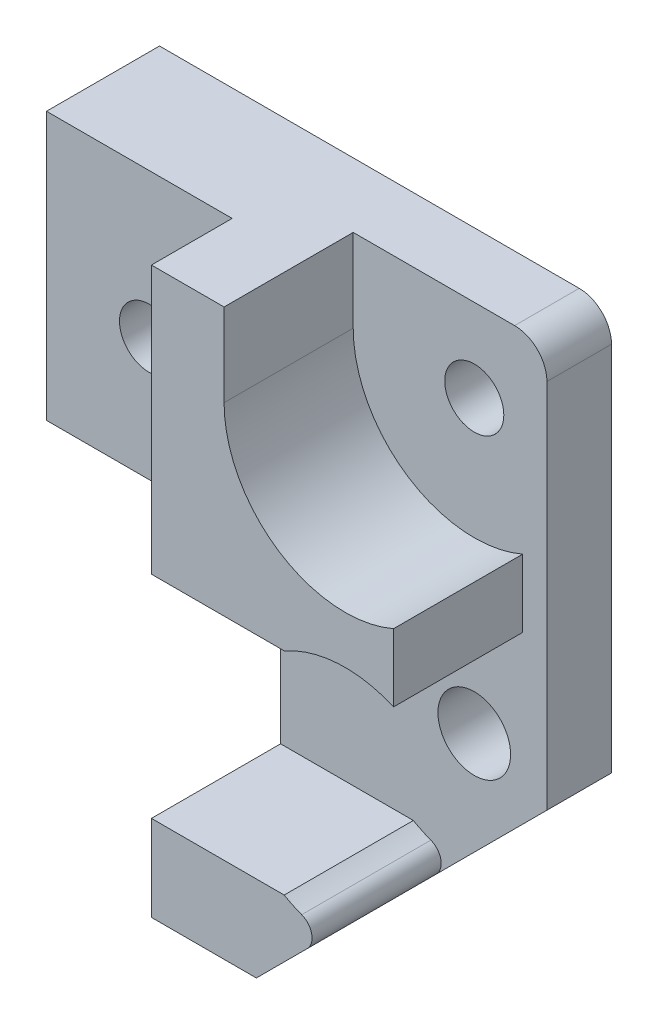
ISO-10303-21;
HEADER;
FILE_DESCRIPTION(('STEP AP214'),'2;1');
FILE_NAME('part.step','',(''),(''),'','','');
FILE_SCHEMA(('AUTOMOTIVE_DESIGN { 1 0 10303 214 1 1 1 1 }'));
ENDSEC;
DATA;
#1=APPLICATION_CONTEXT('core data for automotive mechanical design processes');
#2=APPLICATION_PROTOCOL_DEFINITION('international standard','automotive_design',2000,#1);
#3=PRODUCT_CONTEXT('',#1,'mechanical');
#4=PRODUCT('Part','Part','',(#3));
#5=PRODUCT_RELATED_PRODUCT_CATEGORY('part','',(#4));
#6=PRODUCT_DEFINITION_FORMATION('','',#4);
#7=PRODUCT_DEFINITION_CONTEXT('part definition',#1,'design');
#8=PRODUCT_DEFINITION('design','',#6,#7);
#9=PRODUCT_DEFINITION_SHAPE('','',#8);
#10=(LENGTH_UNIT() NAMED_UNIT(*) SI_UNIT(.MILLI.,.METRE.));
#11=(NAMED_UNIT(*) PLANE_ANGLE_UNIT() SI_UNIT($,.RADIAN.));
#12=(NAMED_UNIT(*) SI_UNIT($,.STERADIAN.) SOLID_ANGLE_UNIT());
#13=UNCERTAINTY_MEASURE_WITH_UNIT(LENGTH_MEASURE(1.E-05),#10,'distance_accuracy_value','');
#14=(GEOMETRIC_REPRESENTATION_CONTEXT(3) GLOBAL_UNCERTAINTY_ASSIGNED_CONTEXT((#13)) GLOBAL_UNIT_ASSIGNED_CONTEXT((#10,
#11,#12)) REPRESENTATION_CONTEXT('',''));
#15=CARTESIAN_POINT('',(0.,0.,0.));
#16=DIRECTION('',(0.,0.,1.));
#17=DIRECTION('',(1.,0.,0.));
#18=AXIS2_PLACEMENT_3D('',#15,#16,#17);
#19=CARTESIAN_POINT('',(23.5,29.8639610306789,8.));
#20=DIRECTION('',(0.,0.,1.));
#21=DIRECTION('',(-1.,0.,0.));
#22=AXIS2_PLACEMENT_3D('',#19,#20,#21);
#23=PLANE('',#22);
#24=DIRECTION('',(1.,0.,0.));
#25=VECTOR('',#24,1.);
#26=CARTESIAN_POINT('',(0.,18.4139610306789,8.));
#27=LINE('',#26,#25);
#28=CARTESIAN_POINT('',(11.5,18.4139610306789,8.));
#29=VERTEX_POINT('',#28);
#30=CARTESIAN_POINT('',(19.7450033288963,18.4139610306789,8.));
#31=VERTEX_POINT('',#30);
#32=EDGE_CURVE('E289',#29,#31,#27,.T.);
#33=ORIENTED_EDGE('',*,*,#32,.T.);
#34=CARTESIAN_POINT('',(23.5,11.8639610306789,8.));
#35=DIRECTION('',(0.,0.,-1.));
#36=DIRECTION('',(-1.,0.,0.));
#37=AXIS2_PLACEMENT_3D('',#34,#35,#36);
#38=CIRCLE('',#37,7.55);
#39=CARTESIAN_POINT('',(26.5,18.7923446805644,8.));
#40=VERTEX_POINT('',#39);
#41=EDGE_CURVE('E313',#31,#40,#38,.T.);
#42=ORIENTED_EDGE('',*,*,#41,.T.);
#43=DIRECTION('',(0.,-1.,0.));
#44=VECTOR('',#43,1.);
#45=CARTESIAN_POINT('',(26.5,0.,8.));
#46=LINE('',#45,#44);
#47=CARTESIAN_POINT('',(26.5,22.9900974882452,8.));
#48=VERTEX_POINT('',#47);
#49=EDGE_CURVE('E269',#48,#40,#46,.T.);
#50=ORIENTED_EDGE('',*,*,#49,.F.);
#51=CARTESIAN_POINT('',(23.5,29.8639610306789,8.));
#52=DIRECTION('',(0.,0.,-1.));
#53=DIRECTION('',(-1.,0.,0.));
#54=AXIS2_PLACEMENT_3D('',#51,#52,#53);
#55=CIRCLE('',#54,7.5);
#56=CARTESIAN_POINT('',(16.,29.8639610306789,8.));
#57=VERTEX_POINT('',#56);
#58=EDGE_CURVE('E299',#48,#57,#55,.T.);
#59=ORIENTED_EDGE('',*,*,#58,.T.);
#60=DIRECTION('',(0.,1.,0.));
#61=VECTOR('',#60,1.);
#62=CARTESIAN_POINT('',(16.,0.,8.));
#63=LINE('',#62,#61);
#64=CARTESIAN_POINT('',(16.,35.,8.));
#65=VERTEX_POINT('',#64);
#66=EDGE_CURVE('E295',#57,#65,#63,.T.);
#67=ORIENTED_EDGE('',*,*,#66,.T.);
#68=DIRECTION('',(1.,0.,0.));
#69=VECTOR('',#68,1.);
#70=CARTESIAN_POINT('',(0.,35.,8.));
#71=LINE('',#70,#69);
#72=CARTESIAN_POINT('',(11.5,35.,8.));
#73=VERTEX_POINT('',#72);
#74=EDGE_CURVE('E303',#73,#65,#71,.T.);
#75=ORIENTED_EDGE('',*,*,#74,.F.);
#76=DIRECTION('',(0.,1.,0.));
#77=VECTOR('',#76,1.);
#78=CARTESIAN_POINT('',(11.5,0.,8.));
#79=LINE('',#78,#77);
#80=EDGE_CURVE('E213',#29,#73,#79,.T.);
#81=ORIENTED_EDGE('',*,*,#80,.F.);
#82=EDGE_LOOP('',(#33,#42,#50,#59,#67,#75,#81));
#83=FACE_BOUND('',#82,.T.);
#84=ADVANCED_FACE('F36',(#83),#23,.T.);
#85=CARTESIAN_POINT('',(0.,0.,-4.));
#86=DIRECTION('',(1.,0.,0.));
#87=DIRECTION('',(0.,0.,1.));
#88=AXIS2_PLACEMENT_3D('',#85,#86,#87);
#89=PLANE('',#88);
#90=DIRECTION('',(0.,1.,0.));
#91=VECTOR('',#90,1.);
#92=CARTESIAN_POINT('',(0.,0.,3.));
#93=LINE('',#92,#91);
#94=CARTESIAN_POINT('',(0.,18.4139610306789,3.));
#95=VERTEX_POINT('',#94);
#96=CARTESIAN_POINT('',(0.,35.,3.));
#97=VERTEX_POINT('',#96);
#98=EDGE_CURVE('E237',#95,#97,#93,.T.);
#99=ORIENTED_EDGE('',*,*,#98,.T.);
#100=DIRECTION('',(0.,0.,1.));
#101=VECTOR('',#100,1.);
#102=CARTESIAN_POINT('',(0.,35.,-4.));
#103=LINE('',#102,#101);
#104=CARTESIAN_POINT('',(0.,35.,-4.));
#105=VERTEX_POINT('',#104);
#106=EDGE_CURVE('E371',#105,#97,#103,.T.);
#107=ORIENTED_EDGE('',*,*,#106,.F.);
#108=DIRECTION('',(0.,-1.,0.));
#109=VECTOR('',#108,1.);
#110=CARTESIAN_POINT('',(0.,0.,-4.));
#111=LINE('',#110,#109);
#112=CARTESIAN_POINT('',(0.,18.4139610306789,-4.));
#113=VERTEX_POINT('',#112);
#114=EDGE_CURVE('E354',#105,#113,#111,.T.);
#115=ORIENTED_EDGE('',*,*,#114,.T.);
#116=DIRECTION('',(0.,0.,1.));
#117=VECTOR('',#116,1.);
#118=CARTESIAN_POINT('',(0.,18.4139610306789,-4.));
#119=LINE('',#118,#117);
#120=EDGE_CURVE('E264',#113,#95,#119,.T.);
#121=ORIENTED_EDGE('',*,*,#120,.T.);
#122=EDGE_LOOP('',(#99,#107,#115,#121));
#123=FACE_BOUND('',#122,.T.);
#124=ADVANCED_FACE('F38',(#123),#89,.F.);
#125=CARTESIAN_POINT('',(0.,35.,-4.));
#126=DIRECTION('',(0.,-1.,0.));
#127=DIRECTION('',(0.,0.,1.));
#128=AXIS2_PLACEMENT_3D('',#125,#126,#127);
#129=PLANE('',#128);
#130=DIRECTION('',(0.,0.,1.));
#131=VECTOR('',#130,1.);
#132=CARTESIAN_POINT('',(11.5,35.,3.));
#133=LINE('',#132,#131);
#134=CARTESIAN_POINT('',(11.5,35.,3.));
#135=VERTEX_POINT('',#134);
#136=EDGE_CURVE('E249',#135,#73,#133,.T.);
#137=ORIENTED_EDGE('',*,*,#136,.T.);
#138=ORIENTED_EDGE('',*,*,#74,.T.);
#139=DIRECTION('',(0.,0.,-1.));
#140=VECTOR('',#139,1.);
#141=CARTESIAN_POINT('',(16.,35.,51.9004555785017));
#142=LINE('',#141,#140);
#143=CARTESIAN_POINT('',(16.,35.,0.));
#144=VERTEX_POINT('',#143);
#145=EDGE_CURVE('E306',#65,#144,#142,.T.);
#146=ORIENTED_EDGE('',*,*,#145,.T.);
#147=DIRECTION('',(-1.,0.,0.));
#148=VECTOR('',#147,1.);
#149=CARTESIAN_POINT('',(0.,35.,0.));
#150=LINE('',#149,#148);
#151=CARTESIAN_POINT('',(26.,35.,0.));
#152=VERTEX_POINT('',#151);
#153=EDGE_CURVE('E358',#152,#144,#150,.T.);
#154=ORIENTED_EDGE('',*,*,#153,.F.);
#155=DIRECTION('',(0.,0.,1.));
#156=VECTOR('',#155,1.);
#157=CARTESIAN_POINT('',(26.,35.,-4.));
#158=LINE('',#157,#156);
#159=CARTESIAN_POINT('',(26.,35.,-4.));
#160=VERTEX_POINT('',#159);
#161=EDGE_CURVE('E383',#160,#152,#158,.T.);
#162=ORIENTED_EDGE('',*,*,#161,.F.);
#163=DIRECTION('',(-1.,0.,0.));
#164=VECTOR('',#163,1.);
#165=CARTESIAN_POINT('',(0.,35.,-4.));
#166=LINE('',#165,#164);
#167=EDGE_CURVE('E369',#160,#105,#166,.T.);
#168=ORIENTED_EDGE('',*,*,#167,.T.);
#169=ORIENTED_EDGE('',*,*,#106,.T.);
#170=DIRECTION('',(1.,0.,0.));
#171=VECTOR('',#170,1.);
#172=CARTESIAN_POINT('',(0.,35.,3.));
#173=LINE('',#172,#171);
#174=EDGE_CURVE('E240',#97,#135,#173,.T.);
#175=ORIENTED_EDGE('',*,*,#174,.T.);
#176=EDGE_LOOP('',(#137,#138,#146,#154,#162,#168,#169,#175));
#177=FACE_BOUND('',#176,.T.);
#178=ADVANCED_FACE('F441',(#177),#129,.F.);
#179=CARTESIAN_POINT('',(0.,18.4139610306789,51.9004555785017));
#180=DIRECTION('',(0.,-1.,0.));
#181=DIRECTION('',(1.,0.,0.));
#182=AXIS2_PLACEMENT_3D('',#179,#180,#181);
#183=PLANE('',#182);
#184=DIRECTION('',(-1.,0.,0.));
#185=VECTOR('',#184,1.);
#186=CARTESIAN_POINT('',(0.,18.4139610306789,3.));
#187=LINE('',#186,#185);
#188=CARTESIAN_POINT('',(11.5,18.4139610306789,3.));
#189=VERTEX_POINT('',#188);
#190=EDGE_CURVE('E235',#189,#95,#187,.T.);
#191=ORIENTED_EDGE('',*,*,#190,.T.);
#192=ORIENTED_EDGE('',*,*,#120,.F.);
#193=DIRECTION('',(1.,0.,0.));
#194=VECTOR('',#193,1.);
#195=CARTESIAN_POINT('',(0.,18.4139610306789,-4.));
#196=LINE('',#195,#194);
#197=CARTESIAN_POINT('',(11.5,18.4139610306789,-4.));
#198=VERTEX_POINT('',#197);
#199=EDGE_CURVE('E259',#113,#198,#196,.T.);
#200=ORIENTED_EDGE('',*,*,#199,.T.);
#201=DIRECTION('',(0.,0.,1.));
#202=VECTOR('',#201,1.);
#203=CARTESIAN_POINT('',(11.5,18.4139610306789,-4.));
#204=LINE('',#203,#202);
#205=CARTESIAN_POINT('',(11.5,18.4139610306789,0.));
#206=VERTEX_POINT('',#205);
#207=EDGE_CURVE('E270',#198,#206,#204,.T.);
#208=ORIENTED_EDGE('',*,*,#207,.T.);
#209=DIRECTION('',(1.,0.,0.));
#210=VECTOR('',#209,1.);
#211=CARTESIAN_POINT('',(0.,18.4139610306789,0.));
#212=LINE('',#211,#210);
#213=CARTESIAN_POINT('',(19.7450033288963,18.4139610306789,0.));
#214=VERTEX_POINT('',#213);
#215=EDGE_CURVE('E281',#206,#214,#212,.T.);
#216=ORIENTED_EDGE('',*,*,#215,.T.);
#217=DIRECTION('',(0.,0.,-1.));
#218=VECTOR('',#217,1.);
#219=CARTESIAN_POINT('',(19.7450033288963,18.4139610306789,51.9004555785017));
#220=LINE('',#219,#218);
#221=EDGE_CURVE('E317',#31,#214,#220,.T.);
#222=ORIENTED_EDGE('',*,*,#221,.F.);
#223=ORIENTED_EDGE('',*,*,#32,.F.);
#224=DIRECTION('',(0.,0.,1.));
#225=VECTOR('',#224,1.);
#226=CARTESIAN_POINT('',(11.5,18.4139610306789,3.));
#227=LINE('',#226,#225);
#228=EDGE_CURVE('E246',#189,#29,#227,.T.);
#229=ORIENTED_EDGE('',*,*,#228,.F.);
#230=EDGE_LOOP('',(#191,#192,#200,#208,#216,#222,#223,#229));
#231=FACE_BOUND('',#230,.T.);
#232=ADVANCED_FACE('F433',(#231),#183,.T.);
#233=CARTESIAN_POINT('',(6.35,26.,-4.));
#234=DIRECTION('',(0.,0.,-1.));
#235=DIRECTION('',(1.,0.,0.));
#236=AXIS2_PLACEMENT_3D('',#233,#234,#235);
#237=CYLINDRICAL_SURFACE('',#236,1.8288);
#238=CARTESIAN_POINT('',(6.35,26.,-0.4948));
#239=DIRECTION('',(0.,0.,1.));
#240=DIRECTION('',(1.,0.,0.));
#241=AXIS2_PLACEMENT_3D('',#238,#239,#240);
#242=CIRCLE('',#241,1.8288);
#243=CARTESIAN_POINT('',(8.1788,26.,-0.4948));
#244=VERTEX_POINT('',#243);
#245=EDGE_CURVE('E251',#244,#244,#242,.T.);
#246=ORIENTED_EDGE('',*,*,#245,.F.);
#247=EDGE_LOOP('',(#246));
#248=FACE_BOUND('',#247,.T.);
#249=CARTESIAN_POINT('',(6.35,26.,3.));
#250=DIRECTION('',(0.,0.,-1.));
#251=DIRECTION('',(-1.,0.,0.));
#252=AXIS2_PLACEMENT_3D('',#249,#250,#251);
#253=CIRCLE('',#252,1.8288);
#254=CARTESIAN_POINT('',(4.5212,26.,3.));
#255=VERTEX_POINT('',#254);
#256=EDGE_CURVE('E243',#255,#255,#253,.F.);
#257=ORIENTED_EDGE('',*,*,#256,.T.);
#258=EDGE_LOOP('',(#257));
#259=FACE_BOUND('',#258,.T.);
#260=ADVANCED_FACE('F500',(#248,#259),#237,.F.);
#261=CARTESIAN_POINT('',(26.,33.,0.));
#262=DIRECTION('',(0.,0.,-1.));
#263=DIRECTION('',(1.,0.,0.));
#264=AXIS2_PLACEMENT_3D('',#261,#262,#263);
#265=PLANE('',#264);
#266=CARTESIAN_POINT('',(23.5,29.8639610306789,0.));
#267=DIRECTION('',(0.,0.,-1.));
#268=DIRECTION('',(-1.,0.,0.));
#269=AXIS2_PLACEMENT_3D('',#266,#267,#268);
#270=CIRCLE('',#269,1.8288);
#271=CARTESIAN_POINT('',(25.3288,29.8639610306789,0.));
#272=VERTEX_POINT('',#271);
#273=EDGE_CURVE('E792',#272,#272,#270,.T.);
#274=ORIENTED_EDGE('',*,*,#273,.T.);
#275=EDGE_LOOP('',(#274));
#276=FACE_BOUND('',#275,.T.);
#277=CARTESIAN_POINT('',(23.5,29.8639610306789,0.));
#278=DIRECTION('',(0.,0.,-1.));
#279=DIRECTION('',(-1.,0.,0.));
#280=AXIS2_PLACEMENT_3D('',#277,#278,#279);
#281=CIRCLE('',#280,7.5);
#282=CARTESIAN_POINT('',(26.5,22.9900974882452,0.));
#283=VERTEX_POINT('',#282);
#284=CARTESIAN_POINT('',(16.,29.8639610306789,0.));
#285=VERTEX_POINT('',#284);
#286=EDGE_CURVE('E278',#283,#285,#281,.T.);
#287=ORIENTED_EDGE('',*,*,#286,.F.);
#288=DIRECTION('',(0.,-1.,0.));
#289=VECTOR('',#288,1.);
#290=CARTESIAN_POINT('',(26.5,0.,0.));
#291=LINE('',#290,#289);
#292=CARTESIAN_POINT('',(26.5,18.7923446805644,0.));
#293=VERTEX_POINT('',#292);
#294=EDGE_CURVE('E296',#283,#293,#291,.T.);
#295=ORIENTED_EDGE('',*,*,#294,.T.);
#296=CARTESIAN_POINT('',(23.5,11.8639610306789,0.));
#297=DIRECTION('',(0.,0.,-1.));
#298=DIRECTION('',(-1.,0.,0.));
#299=AXIS2_PLACEMENT_3D('',#296,#297,#298);
#300=CIRCLE('',#299,7.55);
#301=EDGE_CURVE('E292',#214,#293,#300,.T.);
#302=ORIENTED_EDGE('',*,*,#301,.F.);
#303=ORIENTED_EDGE('',*,*,#215,.F.);
#304=DIRECTION('',(0.,-1.,0.));
#305=VECTOR('',#304,1.);
#306=CARTESIAN_POINT('',(11.5,0.,0.));
#307=LINE('',#306,#305);
#308=CARTESIAN_POINT('',(11.5,5.31396103067893,0.));
#309=VERTEX_POINT('',#308);
#310=EDGE_CURVE('E255',#206,#309,#307,.T.);
#311=ORIENTED_EDGE('',*,*,#310,.T.);
#312=DIRECTION('',(1.,0.,0.));
#313=VECTOR('',#312,1.);
#314=CARTESIAN_POINT('',(0.,5.31396103067893,0.));
#315=LINE('',#314,#313);
#316=CARTESIAN_POINT('',(19.725,5.31396103067893,0.));
#317=VERTEX_POINT('',#316);
#318=EDGE_CURVE('E285',#309,#317,#315,.T.);
#319=ORIENTED_EDGE('',*,*,#318,.T.);
#320=CARTESIAN_POINT('',(23.5,11.8639610306789,0.));
#321=DIRECTION('',(0.,0.,-1.));
#322=DIRECTION('',(-1.,0.,0.));
#323=AXIS2_PLACEMENT_3D('',#320,#321,#322);
#324=CIRCLE('',#323,7.55996858459081);
#325=CARTESIAN_POINT('',(20.807324797528,4.79978200874067,0.));
#326=VERTEX_POINT('',#325);
#327=EDGE_CURVE('E282',#317,#326,#324,.F.);
#328=ORIENTED_EDGE('',*,*,#327,.T.);
#329=CARTESIAN_POINT('',(20.451149348868,3.86536291124113,0.));
#330=DIRECTION('',(0.,0.,-1.));
#331=DIRECTION('',(-1.,0.,0.));
#332=AXIS2_PLACEMENT_3D('',#329,#330,#331);
#333=CIRCLE('',#332,0.999999999999998);
#334=CARTESIAN_POINT('',(21.1582561300546,3.15825613005459,0.));
#335=VERTEX_POINT('',#334);
#336=EDGE_CURVE('E277',#335,#326,#333,.F.);
#337=ORIENTED_EDGE('',*,*,#336,.F.);
#338=DIRECTION('',(0.707106781186547,0.707106781186548,0.));
#339=VECTOR('',#338,1.);
#340=CARTESIAN_POINT('',(18.,0.,0.));
#341=LINE('',#340,#339);
#342=CARTESIAN_POINT('',(28.,10.,0.));
#343=VERTEX_POINT('',#342);
#344=EDGE_CURVE('E351',#335,#343,#341,.T.);
#345=ORIENTED_EDGE('',*,*,#344,.T.);
#346=DIRECTION('',(0.,1.,0.));
#347=VECTOR('',#346,1.);
#348=CARTESIAN_POINT('',(28.,10.,0.));
#349=LINE('',#348,#347);
#350=CARTESIAN_POINT('',(28.,33.,0.));
#351=VERTEX_POINT('',#350);
#352=EDGE_CURVE('E374',#343,#351,#349,.T.);
#353=ORIENTED_EDGE('',*,*,#352,.T.);
#354=CARTESIAN_POINT('',(26.,33.,0.));
#355=DIRECTION('',(0.,0.,1.));
#356=DIRECTION('',(1.,0.,0.));
#357=AXIS2_PLACEMENT_3D('',#354,#355,#356);
#358=CIRCLE('',#357,2.);
#359=EDGE_CURVE('E377',#351,#152,#358,.T.);
#360=ORIENTED_EDGE('',*,*,#359,.T.);
#361=ORIENTED_EDGE('',*,*,#153,.T.);
#362=DIRECTION('',(0.,1.,0.));
#363=VECTOR('',#362,1.);
#364=CARTESIAN_POINT('',(16.,0.,0.));
#365=LINE('',#364,#363);
#366=EDGE_CURVE('E275',#285,#144,#365,.T.);
#367=ORIENTED_EDGE('',*,*,#366,.F.);
#368=EDGE_LOOP('',(#287,#295,#302,#303,#311,#319,#328,#337,#345,#353,#360,#361,#367));
#369=FACE_BOUND('',#368,.T.);
#370=CARTESIAN_POINT('',(23.5,11.8639610306789,0.));
#371=DIRECTION('',(0.,0.,-1.));
#372=DIRECTION('',(-1.,0.,0.));
#373=AXIS2_PLACEMENT_3D('',#370,#371,#372);
#374=CIRCLE('',#373,2.25);
#375=CARTESIAN_POINT('',(21.25,11.8639610306789,0.));
#376=VERTEX_POINT('',#375);
#377=EDGE_CURVE('E347',#376,#376,#374,.T.);
#378=ORIENTED_EDGE('',*,*,#377,.T.);
#379=EDGE_LOOP('',(#378));
#380=FACE_BOUND('',#379,.T.);
#381=ADVANCED_FACE('F421',(#276,#369,#380),#265,.F.);
#382=CARTESIAN_POINT('',(0.,0.,-4.));
#383=DIRECTION('',(0.,1.,0.));
#384=DIRECTION('',(0.,0.,-1.));
#385=AXIS2_PLACEMENT_3D('',#382,#383,#384);
#386=PLANE('',#385);
#387=DIRECTION('',(1.,0.,0.));
#388=VECTOR('',#387,1.);
#389=CARTESIAN_POINT('',(0.,0.,-4.));
#390=LINE('',#389,#388);
#391=CARTESIAN_POINT('',(11.5,0.,-4.));
#392=VERTEX_POINT('',#391);
#393=CARTESIAN_POINT('',(18.,0.,-4.));
#394=VERTEX_POINT('',#393);
#395=EDGE_CURVE('E357',#392,#394,#390,.T.);
#396=ORIENTED_EDGE('',*,*,#395,.T.);
#397=DIRECTION('',(0.,0.,1.));
#398=VECTOR('',#397,1.);
#399=CARTESIAN_POINT('',(18.,0.,-4.));
#400=LINE('',#399,#398);
#401=CARTESIAN_POINT('',(18.,0.,8.));
#402=VERTEX_POINT('',#401);
#403=EDGE_CURVE('E44',#394,#402,#400,.T.);
#404=ORIENTED_EDGE('',*,*,#403,.T.);
#405=DIRECTION('',(-1.,0.,0.));
#406=VECTOR('',#405,1.);
#407=CARTESIAN_POINT('',(0.,0.,8.));
#408=LINE('',#407,#406);
#409=CARTESIAN_POINT('',(11.5,0.,8.));
#410=VERTEX_POINT('',#409);
#411=EDGE_CURVE('E332',#402,#410,#408,.T.);
#412=ORIENTED_EDGE('',*,*,#411,.T.);
#413=DIRECTION('',(0.,0.,1.));
#414=VECTOR('',#413,1.);
#415=CARTESIAN_POINT('',(11.5,0.,-4.));
#416=LINE('',#415,#414);
#417=EDGE_CURVE('E266',#392,#410,#416,.T.);
#418=ORIENTED_EDGE('',*,*,#417,.F.);
#419=EDGE_LOOP('',(#396,#404,#412,#418));
#420=FACE_BOUND('',#419,.T.);
#421=ADVANCED_FACE('F392',(#420),#386,.F.);
#422=CARTESIAN_POINT('',(18.,0.,-4.));
#423=DIRECTION('',(-0.707106781186548,0.707106781186547,0.));
#424=DIRECTION('',(-0.707106781186547,-0.707106781186548,0.));
#425=AXIS2_PLACEMENT_3D('',#422,#423,#424);
#426=PLANE('',#425);
#427=ORIENTED_EDGE('',*,*,#403,.F.);
#428=DIRECTION('',(0.707106781186547,0.707106781186548,0.));
#429=VECTOR('',#428,1.);
#430=CARTESIAN_POINT('',(18.,0.,-4.));
#431=LINE('',#430,#429);
#432=CARTESIAN_POINT('',(28.,10.,-4.));
#433=VERTEX_POINT('',#432);
#434=EDGE_CURVE('E361',#394,#433,#431,.T.);
#435=ORIENTED_EDGE('',*,*,#434,.T.);
#436=DIRECTION('',(0.,0.,1.));
#437=VECTOR('',#436,1.);
#438=CARTESIAN_POINT('',(28.,10.,-4.));
#439=LINE('',#438,#437);
#440=EDGE_CURVE('E388',#433,#343,#439,.T.);
#441=ORIENTED_EDGE('',*,*,#440,.T.);
#442=ORIENTED_EDGE('',*,*,#344,.F.);
#443=DIRECTION('',(0.,0.,-1.));
#444=VECTOR('',#443,1.);
#445=CARTESIAN_POINT('',(21.1582561300546,3.15825613005459,51.9004555785017));
#446=LINE('',#445,#444);
#447=CARTESIAN_POINT('',(21.1582561300546,3.15825613005459,8.));
#448=VERTEX_POINT('',#447);
#449=EDGE_CURVE('E330',#448,#335,#446,.T.);
#450=ORIENTED_EDGE('',*,*,#449,.F.);
#451=DIRECTION('',(-0.707106781186548,-0.707106781186548,0.));
#452=VECTOR('',#451,1.);
#453=CARTESIAN_POINT('',(9.,-9.,8.));
#454=LINE('',#453,#452);
#455=EDGE_CURVE('E325',#448,#402,#454,.T.);
#456=ORIENTED_EDGE('',*,*,#455,.T.);
#457=EDGE_LOOP('',(#427,#435,#441,#442,#450,#456));
#458=FACE_BOUND('',#457,.T.);
#459=ADVANCED_FACE('F397',(#458),#426,.F.);
#460=CARTESIAN_POINT('',(28.,10.,-4.));
#461=DIRECTION('',(-1.,0.,0.));
#462=DIRECTION('',(0.,-1.,0.));
#463=AXIS2_PLACEMENT_3D('',#460,#461,#462);
#464=PLANE('',#463);
#465=ORIENTED_EDGE('',*,*,#352,.F.);
#466=ORIENTED_EDGE('',*,*,#440,.F.);
#467=DIRECTION('',(0.,1.,0.));
#468=VECTOR('',#467,1.);
#469=CARTESIAN_POINT('',(28.,10.,-4.));
#470=LINE('',#469,#468);
#471=CARTESIAN_POINT('',(28.,33.,-4.));
#472=VERTEX_POINT('',#471);
#473=EDGE_CURVE('E364',#433,#472,#470,.T.);
#474=ORIENTED_EDGE('',*,*,#473,.T.);
#475=DIRECTION('',(0.,0.,1.));
#476=VECTOR('',#475,1.);
#477=CARTESIAN_POINT('',(28.,33.,-4.));
#478=LINE('',#477,#476);
#479=EDGE_CURVE('E386',#472,#351,#478,.T.);
#480=ORIENTED_EDGE('',*,*,#479,.T.);
#481=EDGE_LOOP('',(#465,#466,#474,#480));
#482=FACE_BOUND('',#481,.T.);
#483=ADVANCED_FACE('F417',(#482),#464,.F.);
#484=CARTESIAN_POINT('',(26.,33.,-4.));
#485=DIRECTION('',(0.,0.,1.));
#486=DIRECTION('',(-1.,0.,0.));
#487=AXIS2_PLACEMENT_3D('',#484,#485,#486);
#488=CYLINDRICAL_SURFACE('',#487,2.);
#489=ORIENTED_EDGE('',*,*,#359,.F.);
#490=ORIENTED_EDGE('',*,*,#479,.F.);
#491=CARTESIAN_POINT('',(26.,33.,-4.));
#492=DIRECTION('',(0.,0.,1.));
#493=DIRECTION('',(1.,0.,0.));
#494=AXIS2_PLACEMENT_3D('',#491,#492,#493);
#495=CIRCLE('',#494,2.);
#496=EDGE_CURVE('E367',#472,#160,#495,.T.);
#497=ORIENTED_EDGE('',*,*,#496,.T.);
#498=ORIENTED_EDGE('',*,*,#161,.T.);
#499=EDGE_LOOP('',(#489,#490,#497,#498));
#500=FACE_BOUND('',#499,.T.);
#501=ADVANCED_FACE('F445',(#500),#488,.T.);
#502=CARTESIAN_POINT('',(26.,33.,-4.));
#503=DIRECTION('',(0.,0.,-1.));
#504=DIRECTION('',(1.,0.,0.));
#505=AXIS2_PLACEMENT_3D('',#502,#503,#504);
#506=PLANE('',#505);
#507=CARTESIAN_POINT('',(23.5,29.8639610306789,-4.));
#508=DIRECTION('',(0.,0.,1.));
#509=DIRECTION('',(1.,0.,0.));
#510=AXIS2_PLACEMENT_3D('',#507,#508,#509);
#511=CIRCLE('',#510,1.8288);
#512=CARTESIAN_POINT('',(25.3288,29.8639610306789,-4.));
#513=VERTEX_POINT('',#512);
#514=EDGE_CURVE('E797',#513,#513,#511,.T.);
#515=ORIENTED_EDGE('',*,*,#514,.T.);
#516=EDGE_LOOP('',(#515));
#517=FACE_BOUND('',#516,.T.);
#518=DIRECTION('',(0.866025403784439,0.5,0.));
#519=VECTOR('',#518,1.);
#520=CARTESIAN_POINT('',(-11.7333302491977,20.3227241335952,-4.));
#521=LINE('',#520,#519);
#522=CARTESIAN_POINT('',(2.225,28.3815698604072,-4.));
#523=VERTEX_POINT('',#522);
#524=CARTESIAN_POINT('',(6.35,30.7631397208144,-4.));
#525=VERTEX_POINT('',#524);
#526=EDGE_CURVE('E773',#523,#525,#521,.T.);
#527=ORIENTED_EDGE('',*,*,#526,.F.);
#528=DIRECTION('',(0.,1.,0.));
#529=VECTOR('',#528,1.);
#530=CARTESIAN_POINT('',(2.22500000000001,0.,-4.));
#531=LINE('',#530,#529);
#532=CARTESIAN_POINT('',(2.225,23.6184301395928,-4.));
#533=VERTEX_POINT('',#532);
#534=EDGE_CURVE('E222',#533,#523,#531,.T.);
#535=ORIENTED_EDGE('',*,*,#534,.F.);
#536=DIRECTION('',(-0.866025403784439,0.5,0.));
#537=VECTOR('',#536,1.);
#538=CARTESIAN_POINT('',(10.7833302491977,18.6772758664048,-4.));
#539=LINE('',#538,#537);
#540=CARTESIAN_POINT('',(6.35,21.2368602791856,-4.));
#541=VERTEX_POINT('',#540);
#542=EDGE_CURVE('E51',#541,#533,#539,.T.);
#543=ORIENTED_EDGE('',*,*,#542,.F.);
#544=DIRECTION('',(-0.866025403784439,-0.5,0.));
#545=VECTOR('',#544,1.);
#546=CARTESIAN_POINT('',(-7.6083302491977,13.1780145523736,-4.));
#547=LINE('',#546,#545);
#548=CARTESIAN_POINT('',(10.475,23.6184301395928,-4.));
#549=VERTEX_POINT('',#548);
#550=EDGE_CURVE('E230',#549,#541,#547,.T.);
#551=ORIENTED_EDGE('',*,*,#550,.F.);
#552=DIRECTION('',(0.,-1.,0.));
#553=VECTOR('',#552,1.);
#554=CARTESIAN_POINT('',(10.475,0.,-4.));
#555=LINE('',#554,#553);
#556=CARTESIAN_POINT('',(10.475,28.3815698604072,-4.));
#557=VERTEX_POINT('',#556);
#558=EDGE_CURVE('E778',#557,#549,#555,.T.);
#559=ORIENTED_EDGE('',*,*,#558,.F.);
#560=DIRECTION('',(0.866025403784438,-0.5,0.));
#561=VECTOR('',#560,1.);
#562=CARTESIAN_POINT('',(14.9083302491977,25.8219854476264,-4.));
#563=LINE('',#562,#561);
#564=EDGE_CURVE('E770',#525,#557,#563,.T.);
#565=ORIENTED_EDGE('',*,*,#564,.F.);
#566=EDGE_LOOP('',(#527,#535,#543,#551,#559,#565));
#567=FACE_BOUND('',#566,.T.);
#568=DIRECTION('',(0.,-1.,0.));
#569=VECTOR('',#568,1.);
#570=CARTESIAN_POINT('',(11.5,0.,-4.));
#571=LINE('',#570,#569);
#572=EDGE_CURVE('E262',#198,#392,#571,.T.);
#573=ORIENTED_EDGE('',*,*,#572,.F.);
#574=ORIENTED_EDGE('',*,*,#199,.F.);
#575=ORIENTED_EDGE('',*,*,#114,.F.);
#576=ORIENTED_EDGE('',*,*,#167,.F.);
#577=ORIENTED_EDGE('',*,*,#496,.F.);
#578=ORIENTED_EDGE('',*,*,#473,.F.);
#579=ORIENTED_EDGE('',*,*,#434,.F.);
#580=ORIENTED_EDGE('',*,*,#395,.F.);
#581=EDGE_LOOP('',(#573,#574,#575,#576,#577,#578,#579,#580));
#582=FACE_BOUND('',#581,.T.);
#583=CARTESIAN_POINT('',(23.5,11.8639610306789,-4.));
#584=DIRECTION('',(0.,0.,-1.));
#585=DIRECTION('',(-1.,0.,0.));
#586=AXIS2_PLACEMENT_3D('',#583,#584,#585);
#587=CIRCLE('',#586,2.25);
#588=CARTESIAN_POINT('',(21.25,11.8639610306789,-4.));
#589=VERTEX_POINT('',#588);
#590=EDGE_CURVE('E348',#589,#589,#587,.T.);
#591=ORIENTED_EDGE('',*,*,#590,.F.);
#592=EDGE_LOOP('',(#591));
#593=FACE_BOUND('',#592,.T.);
#594=ADVANCED_FACE('F410',(#517,#567,#582,#593),#506,.T.);
#595=CARTESIAN_POINT('',(23.5,11.8639610306789,-4.));
#596=DIRECTION('',(0.,0.,1.));
#597=DIRECTION('',(-1.,0.,0.));
#598=AXIS2_PLACEMENT_3D('',#595,#596,#597);
#599=CYLINDRICAL_SURFACE('',#598,2.25);
#600=ORIENTED_EDGE('',*,*,#590,.T.);
#601=EDGE_LOOP('',(#600));
#602=FACE_BOUND('',#601,.T.);
#603=ORIENTED_EDGE('',*,*,#377,.F.);
#604=EDGE_LOOP('',(#603));
#605=FACE_BOUND('',#604,.T.);
#606=ADVANCED_FACE('F485',(#602,#605),#599,.F.);
#607=DIRECTION('',(0.,-1.,0.));
#608=VECTOR('',#607,1.);
#609=CARTESIAN_POINT('',(11.5,0.,8.));
#610=LINE('',#609,#608);
#611=CARTESIAN_POINT('',(11.5,5.31396103067893,8.));
#612=VERTEX_POINT('',#611);
#613=EDGE_CURVE('E258',#612,#410,#610,.T.);
#614=ORIENTED_EDGE('',*,*,#613,.T.);
#615=ORIENTED_EDGE('',*,*,#411,.F.);
#616=ORIENTED_EDGE('',*,*,#455,.F.);
#617=CARTESIAN_POINT('',(20.451149348868,3.86536291124113,8.));
#618=DIRECTION('',(0.,0.,-1.));
#619=DIRECTION('',(-1.,0.,0.));
#620=AXIS2_PLACEMENT_3D('',#617,#618,#619);
#621=CIRCLE('',#620,0.999999999999998);
#622=CARTESIAN_POINT('',(20.807324797528,4.79978200874067,8.));
#623=VERTEX_POINT('',#622);
#624=EDGE_CURVE('E326',#448,#623,#621,.F.);
#625=ORIENTED_EDGE('',*,*,#624,.T.);
#626=CARTESIAN_POINT('',(23.5,11.8639610306789,8.));
#627=DIRECTION('',(0.,0.,-1.));
#628=DIRECTION('',(-1.,0.,0.));
#629=AXIS2_PLACEMENT_3D('',#626,#627,#628);
#630=CIRCLE('',#629,7.55996858459081);
#631=CARTESIAN_POINT('',(19.725,5.31396103067893,8.));
#632=VERTEX_POINT('',#631);
#633=EDGE_CURVE('E322',#632,#623,#630,.F.);
#634=ORIENTED_EDGE('',*,*,#633,.F.);
#635=DIRECTION('',(1.,0.,0.));
#636=VECTOR('',#635,1.);
#637=CARTESIAN_POINT('',(0.,5.31396103067893,8.));
#638=LINE('',#637,#636);
#639=EDGE_CURVE('E312',#612,#632,#638,.T.);
#640=ORIENTED_EDGE('',*,*,#639,.F.);
#641=EDGE_LOOP('',(#614,#615,#616,#625,#634,#640));
#642=FACE_BOUND('',#641,.T.);
#643=ADVANCED_FACE('F402',(#642),#23,.T.);
#644=CARTESIAN_POINT('',(16.,0.,51.9004555785017));
#645=DIRECTION('',(1.,0.,0.));
#646=DIRECTION('',(0.,0.,1.));
#647=AXIS2_PLACEMENT_3D('',#644,#645,#646);
#648=PLANE('',#647);
#649=DIRECTION('',(0.,0.,-1.));
#650=VECTOR('',#649,1.);
#651=CARTESIAN_POINT('',(16.,29.8639610306789,51.9004555785017));
#652=LINE('',#651,#650);
#653=EDGE_CURVE('E309',#57,#285,#652,.T.);
#654=ORIENTED_EDGE('',*,*,#653,.T.);
#655=ORIENTED_EDGE('',*,*,#366,.T.);
#656=ORIENTED_EDGE('',*,*,#145,.F.);
#657=ORIENTED_EDGE('',*,*,#66,.F.);
#658=EDGE_LOOP('',(#654,#655,#656,#657));
#659=FACE_BOUND('',#658,.T.);
#660=ADVANCED_FACE('F450',(#659),#648,.T.);
#661=CARTESIAN_POINT('',(20.451149348868,3.86536291124113,51.9004555785017));
#662=DIRECTION('',(0.,0.,-1.));
#663=DIRECTION('',(1.,0.,0.));
#664=AXIS2_PLACEMENT_3D('',#661,#662,#663);
#665=CYLINDRICAL_SURFACE('',#664,0.999999999999998);
#666=ORIENTED_EDGE('',*,*,#449,.T.);
#667=ORIENTED_EDGE('',*,*,#336,.T.);
#668=DIRECTION('',(0.,0.,-1.));
#669=VECTOR('',#668,1.);
#670=CARTESIAN_POINT('',(20.807324797528,4.79978200874067,51.9004555785017));
#671=LINE('',#670,#669);
#672=EDGE_CURVE('E329',#623,#326,#671,.T.);
#673=ORIENTED_EDGE('',*,*,#672,.F.);
#674=ORIENTED_EDGE('',*,*,#624,.F.);
#675=EDGE_LOOP('',(#666,#667,#673,#674));
#676=FACE_BOUND('',#675,.T.);
#677=ADVANCED_FACE('F425',(#676),#665,.T.);
#678=CARTESIAN_POINT('',(23.5,11.8639610306789,51.9004555785017));
#679=DIRECTION('',(0.,0.,-1.));
#680=DIRECTION('',(1.,0.,0.));
#681=AXIS2_PLACEMENT_3D('',#678,#679,#680);
#682=CYLINDRICAL_SURFACE('',#681,7.55996858459081);
#683=ORIENTED_EDGE('',*,*,#633,.T.);
#684=ORIENTED_EDGE('',*,*,#672,.T.);
#685=ORIENTED_EDGE('',*,*,#327,.F.);
#686=DIRECTION('',(0.,0.,-1.));
#687=VECTOR('',#686,1.);
#688=CARTESIAN_POINT('',(19.725,5.31396103067893,51.9004555785017));
#689=LINE('',#688,#687);
#690=EDGE_CURVE('E286',#632,#317,#689,.T.);
#691=ORIENTED_EDGE('',*,*,#690,.F.);
#692=EDGE_LOOP('',(#683,#684,#685,#691));
#693=FACE_BOUND('',#692,.T.);
#694=ADVANCED_FACE('F427',(#693),#682,.F.);
#695=CARTESIAN_POINT('',(0.,5.31396103067893,51.9004555785017));
#696=DIRECTION('',(0.,-1.,0.));
#697=DIRECTION('',(1.,0.,0.));
#698=AXIS2_PLACEMENT_3D('',#695,#696,#697);
#699=PLANE('',#698);
#700=ORIENTED_EDGE('',*,*,#639,.T.);
#701=ORIENTED_EDGE('',*,*,#690,.T.);
#702=ORIENTED_EDGE('',*,*,#318,.F.);
#703=DIRECTION('',(0.,0.,1.));
#704=VECTOR('',#703,1.);
#705=CARTESIAN_POINT('',(11.5,5.31396103067893,-4.));
#706=LINE('',#705,#704);
#707=EDGE_CURVE('E11',#309,#612,#706,.T.);
#708=ORIENTED_EDGE('',*,*,#707,.T.);
#709=EDGE_LOOP('',(#700,#701,#702,#708));
#710=FACE_BOUND('',#709,.T.);
#711=ADVANCED_FACE('F430',(#710),#699,.F.);
#712=CARTESIAN_POINT('',(23.5,11.8639610306789,51.9004555785017));
#713=DIRECTION('',(0.,0.,-1.));
#714=DIRECTION('',(1.,0.,0.));
#715=AXIS2_PLACEMENT_3D('',#712,#713,#714);
#716=CYLINDRICAL_SURFACE('',#715,7.55);
#717=ORIENTED_EDGE('',*,*,#221,.T.);
#718=ORIENTED_EDGE('',*,*,#301,.T.);
#719=DIRECTION('',(0.,0.,-1.));
#720=VECTOR('',#719,1.);
#721=CARTESIAN_POINT('',(26.5,18.7923446805644,51.9004555785017));
#722=LINE('',#721,#720);
#723=EDGE_CURVE('E316',#40,#293,#722,.T.);
#724=ORIENTED_EDGE('',*,*,#723,.F.);
#725=ORIENTED_EDGE('',*,*,#41,.F.);
#726=EDGE_LOOP('',(#717,#718,#724,#725));
#727=FACE_BOUND('',#726,.T.);
#728=ADVANCED_FACE('F460',(#727),#716,.F.);
#729=CARTESIAN_POINT('',(26.5,0.,51.9004555785017));
#730=DIRECTION('',(-1.,0.,0.));
#731=DIRECTION('',(0.,-1.,0.));
#732=AXIS2_PLACEMENT_3D('',#729,#730,#731);
#733=PLANE('',#732);
#734=ORIENTED_EDGE('',*,*,#49,.T.);
#735=ORIENTED_EDGE('',*,*,#723,.T.);
#736=ORIENTED_EDGE('',*,*,#294,.F.);
#737=DIRECTION('',(0.,0.,-1.));
#738=VECTOR('',#737,1.);
#739=CARTESIAN_POINT('',(26.5,22.9900974882452,51.9004555785017));
#740=LINE('',#739,#738);
#741=EDGE_CURVE('E300',#48,#283,#740,.T.);
#742=ORIENTED_EDGE('',*,*,#741,.F.);
#743=EDGE_LOOP('',(#734,#735,#736,#742));
#744=FACE_BOUND('',#743,.T.);
#745=ADVANCED_FACE('F457',(#744),#733,.F.);
#746=CARTESIAN_POINT('',(23.5,29.8639610306789,51.9004555785017));
#747=DIRECTION('',(0.,0.,-1.));
#748=DIRECTION('',(1.,0.,0.));
#749=AXIS2_PLACEMENT_3D('',#746,#747,#748);
#750=CYLINDRICAL_SURFACE('',#749,7.5);
#751=ORIENTED_EDGE('',*,*,#741,.T.);
#752=ORIENTED_EDGE('',*,*,#286,.T.);
#753=ORIENTED_EDGE('',*,*,#653,.F.);
#754=ORIENTED_EDGE('',*,*,#58,.F.);
#755=EDGE_LOOP('',(#751,#752,#753,#754));
#756=FACE_BOUND('',#755,.T.);
#757=ADVANCED_FACE('F453',(#756),#750,.F.);
#758=CARTESIAN_POINT('',(11.5,0.,-4.));
#759=DIRECTION('',(1.,0.,0.));
#760=DIRECTION('',(0.,0.,1.));
#761=AXIS2_PLACEMENT_3D('',#758,#759,#760);
#762=PLANE('',#761);
#763=ORIENTED_EDGE('',*,*,#310,.F.);
#764=ORIENTED_EDGE('',*,*,#207,.F.);
#765=ORIENTED_EDGE('',*,*,#572,.T.);
#766=ORIENTED_EDGE('',*,*,#417,.T.);
#767=ORIENTED_EDGE('',*,*,#613,.F.);
#768=ORIENTED_EDGE('',*,*,#707,.F.);
#769=EDGE_LOOP('',(#763,#764,#765,#766,#767,#768));
#770=FACE_BOUND('',#769,.T.);
#771=ADVANCED_FACE('F407',(#770),#762,.F.);
#772=CARTESIAN_POINT('',(8.1788,26.,-0.4948));
#773=DIRECTION('',(0.,0.,1.));
#774=DIRECTION('',(-1.,0.,0.));
#775=AXIS2_PLACEMENT_3D('',#772,#773,#774);
#776=PLANE('',#775);
#777=ORIENTED_EDGE('',*,*,#245,.T.);
#778=EDGE_LOOP('',(#777));
#779=FACE_BOUND('',#778,.T.);
#780=DIRECTION('',(0.,1.,0.));
#781=VECTOR('',#780,1.);
#782=CARTESIAN_POINT('',(2.22500000000001,0.,-0.4948));
#783=LINE('',#782,#781);
#784=CARTESIAN_POINT('',(2.22500000000001,23.6184301395928,-0.4948));
#785=VERTEX_POINT('',#784);
#786=CARTESIAN_POINT('',(2.225,28.3815698604072,-0.4948));
#787=VERTEX_POINT('',#786);
#788=EDGE_CURVE('E217',#785,#787,#783,.T.);
#789=ORIENTED_EDGE('',*,*,#788,.T.);
#790=DIRECTION('',(0.866025403784439,0.5,0.));
#791=VECTOR('',#790,1.);
#792=CARTESIAN_POINT('',(-11.7333302491977,20.3227241335952,-0.4948));
#793=LINE('',#792,#791);
#794=CARTESIAN_POINT('',(6.35,30.7631397208144,-0.4948));
#795=VERTEX_POINT('',#794);
#796=EDGE_CURVE('E203',#787,#795,#793,.T.);
#797=ORIENTED_EDGE('',*,*,#796,.T.);
#798=DIRECTION('',(0.866025403784438,-0.5,0.));
#799=VECTOR('',#798,1.);
#800=CARTESIAN_POINT('',(14.9083302491977,25.8219854476264,-0.4948));
#801=LINE('',#800,#799);
#802=CARTESIAN_POINT('',(10.475,28.3815698604072,-0.4948));
#803=VERTEX_POINT('',#802);
#804=EDGE_CURVE('E772',#795,#803,#801,.T.);
#805=ORIENTED_EDGE('',*,*,#804,.T.);
#806=DIRECTION('',(0.,-1.,0.));
#807=VECTOR('',#806,1.);
#808=CARTESIAN_POINT('',(10.475,0.,-0.4948));
#809=LINE('',#808,#807);
#810=CARTESIAN_POINT('',(10.475,23.6184301395928,-0.4948));
#811=VERTEX_POINT('',#810);
#812=EDGE_CURVE('E791',#803,#811,#809,.T.);
#813=ORIENTED_EDGE('',*,*,#812,.T.);
#814=DIRECTION('',(-0.866025403784439,-0.5,0.));
#815=VECTOR('',#814,1.);
#816=CARTESIAN_POINT('',(-7.6083302491977,13.1780145523736,-0.4948));
#817=LINE('',#816,#815);
#818=CARTESIAN_POINT('',(6.35,21.2368602791856,-0.4948));
#819=VERTEX_POINT('',#818);
#820=EDGE_CURVE('E794',#811,#819,#817,.T.);
#821=ORIENTED_EDGE('',*,*,#820,.T.);
#822=DIRECTION('',(-0.866025403784439,0.5,0.));
#823=VECTOR('',#822,1.);
#824=CARTESIAN_POINT('',(10.7833302491977,18.6772758664048,-0.4948));
#825=LINE('',#824,#823);
#826=EDGE_CURVE('E220',#819,#785,#825,.T.);
#827=ORIENTED_EDGE('',*,*,#826,.T.);
#828=EDGE_LOOP('',(#789,#797,#805,#813,#821,#827));
#829=FACE_BOUND('',#828,.T.);
#830=ADVANCED_FACE('F218',(#779,#829),#776,.F.);
#831=CARTESIAN_POINT('',(11.5,0.,3.));
#832=DIRECTION('',(-1.,0.,0.));
#833=DIRECTION('',(0.,0.,-1.));
#834=AXIS2_PLACEMENT_3D('',#831,#832,#833);
#835=PLANE('',#834);
#836=ORIENTED_EDGE('',*,*,#80,.T.);
#837=ORIENTED_EDGE('',*,*,#136,.F.);
#838=DIRECTION('',(0.,1.,0.));
#839=VECTOR('',#838,1.);
#840=CARTESIAN_POINT('',(11.5,0.,3.));
#841=LINE('',#840,#839);
#842=EDGE_CURVE('E59',#189,#135,#841,.T.);
#843=ORIENTED_EDGE('',*,*,#842,.F.);
#844=ORIENTED_EDGE('',*,*,#228,.T.);
#845=EDGE_LOOP('',(#836,#837,#843,#844));
#846=FACE_BOUND('',#845,.T.);
#847=ADVANCED_FACE('F465',(#846),#835,.T.);
#848=CARTESIAN_POINT('',(0.,0.,3.));
#849=DIRECTION('',(0.,0.,1.));
#850=DIRECTION('',(-1.,0.,0.));
#851=AXIS2_PLACEMENT_3D('',#848,#849,#850);
#852=PLANE('',#851);
#853=ORIENTED_EDGE('',*,*,#842,.T.);
#854=ORIENTED_EDGE('',*,*,#174,.F.);
#855=ORIENTED_EDGE('',*,*,#98,.F.);
#856=ORIENTED_EDGE('',*,*,#190,.F.);
#857=EDGE_LOOP('',(#853,#854,#855,#856));
#858=FACE_BOUND('',#857,.T.);
#859=ORIENTED_EDGE('',*,*,#256,.F.);
#860=EDGE_LOOP('',(#859));
#861=FACE_BOUND('',#860,.T.);
#862=ADVANCED_FACE('F467',(#858,#861),#852,.T.);
#863=CARTESIAN_POINT('',(-11.7333302491977,20.3227241335952,12.1072831611286));
#864=DIRECTION('',(-0.5,0.866025403784439,0.));
#865=DIRECTION('',(-0.866025403784439,-0.5,0.));
#866=AXIS2_PLACEMENT_3D('',#863,#864,#865);
#867=PLANE('',#866);
#868=DIRECTION('',(0.,0.,-1.));
#869=VECTOR('',#868,1.);
#870=CARTESIAN_POINT('',(2.225,28.3815698604072,12.1072831611286));
#871=LINE('',#870,#869);
#872=EDGE_CURVE('E208',#787,#523,#871,.T.);
#873=ORIENTED_EDGE('',*,*,#872,.T.);
#874=ORIENTED_EDGE('',*,*,#526,.T.);
#875=DIRECTION('',(0.,0.,-1.));
#876=VECTOR('',#875,1.);
#877=CARTESIAN_POINT('',(6.35,30.7631397208144,12.1072831611286));
#878=LINE('',#877,#876);
#879=EDGE_CURVE('E210',#795,#525,#878,.T.);
#880=ORIENTED_EDGE('',*,*,#879,.F.);
#881=ORIENTED_EDGE('',*,*,#796,.F.);
#882=EDGE_LOOP('',(#873,#874,#880,#881));
#883=FACE_BOUND('',#882,.T.);
#884=ADVANCED_FACE('F205',(#883),#867,.F.);
#885=CARTESIAN_POINT('',(14.9083302491977,25.8219854476264,12.1072831611286));
#886=DIRECTION('',(0.5,0.866025403784438,0.));
#887=DIRECTION('',(-0.866025403784438,0.5,0.));
#888=AXIS2_PLACEMENT_3D('',#885,#886,#887);
#889=PLANE('',#888);
#890=ORIENTED_EDGE('',*,*,#879,.T.);
#891=ORIENTED_EDGE('',*,*,#564,.T.);
#892=DIRECTION('',(0.,0.,-1.));
#893=VECTOR('',#892,1.);
#894=CARTESIAN_POINT('',(10.475,28.3815698604072,12.1072831611286));
#895=LINE('',#894,#893);
#896=EDGE_CURVE('E228',#803,#557,#895,.T.);
#897=ORIENTED_EDGE('',*,*,#896,.F.);
#898=ORIENTED_EDGE('',*,*,#804,.F.);
#899=EDGE_LOOP('',(#890,#891,#897,#898));
#900=FACE_BOUND('',#899,.T.);
#901=ADVANCED_FACE('F575',(#900),#889,.F.);
#902=CARTESIAN_POINT('',(10.475,0.,12.1072831611286));
#903=DIRECTION('',(1.,0.,0.));
#904=DIRECTION('',(0.,0.,-1.));
#905=AXIS2_PLACEMENT_3D('',#902,#903,#904);
#906=PLANE('',#905);
#907=ORIENTED_EDGE('',*,*,#896,.T.);
#908=ORIENTED_EDGE('',*,*,#558,.T.);
#909=DIRECTION('',(0.,0.,-1.));
#910=VECTOR('',#909,1.);
#911=CARTESIAN_POINT('',(10.475,23.6184301395928,12.1072831611286));
#912=LINE('',#911,#910);
#913=EDGE_CURVE('E788',#811,#549,#912,.T.);
#914=ORIENTED_EDGE('',*,*,#913,.F.);
#915=ORIENTED_EDGE('',*,*,#812,.F.);
#916=EDGE_LOOP('',(#907,#908,#914,#915));
#917=FACE_BOUND('',#916,.T.);
#918=ADVANCED_FACE('F567',(#917),#906,.F.);
#919=CARTESIAN_POINT('',(-7.6083302491977,13.1780145523736,12.1072831611286));
#920=DIRECTION('',(0.5,-0.866025403784439,0.));
#921=DIRECTION('',(0.866025403784439,0.5,0.));
#922=AXIS2_PLACEMENT_3D('',#919,#920,#921);
#923=PLANE('',#922);
#924=ORIENTED_EDGE('',*,*,#913,.T.);
#925=ORIENTED_EDGE('',*,*,#550,.T.);
#926=DIRECTION('',(0.,0.,-1.));
#927=VECTOR('',#926,1.);
#928=CARTESIAN_POINT('',(6.35,21.2368602791856,12.1072831611286));
#929=LINE('',#928,#927);
#930=EDGE_CURVE('E786',#819,#541,#929,.T.);
#931=ORIENTED_EDGE('',*,*,#930,.F.);
#932=ORIENTED_EDGE('',*,*,#820,.F.);
#933=EDGE_LOOP('',(#924,#925,#931,#932));
#934=FACE_BOUND('',#933,.T.);
#935=ADVANCED_FACE('F560',(#934),#923,.F.);
#936=CARTESIAN_POINT('',(10.7833302491977,18.6772758664048,12.1072831611286));
#937=DIRECTION('',(-0.5,-0.866025403784439,0.));
#938=DIRECTION('',(0.866025403784439,-0.5,0.));
#939=AXIS2_PLACEMENT_3D('',#936,#937,#938);
#940=PLANE('',#939);
#941=ORIENTED_EDGE('',*,*,#930,.T.);
#942=ORIENTED_EDGE('',*,*,#542,.T.);
#943=DIRECTION('',(0.,0.,-1.));
#944=VECTOR('',#943,1.);
#945=CARTESIAN_POINT('',(2.22500000000001,23.6184301395928,12.1072831611286));
#946=LINE('',#945,#944);
#947=EDGE_CURVE('E214',#785,#533,#946,.T.);
#948=ORIENTED_EDGE('',*,*,#947,.F.);
#949=ORIENTED_EDGE('',*,*,#826,.F.);
#950=EDGE_LOOP('',(#941,#942,#948,#949));
#951=FACE_BOUND('',#950,.T.);
#952=ADVANCED_FACE('F553',(#951),#940,.F.);
#953=CARTESIAN_POINT('',(2.22500000000001,0.,12.1072831611286));
#954=DIRECTION('',(-1.,0.,0.));
#955=DIRECTION('',(0.,-1.,0.));
#956=AXIS2_PLACEMENT_3D('',#953,#954,#955);
#957=PLANE('',#956);
#958=ORIENTED_EDGE('',*,*,#947,.T.);
#959=ORIENTED_EDGE('',*,*,#534,.T.);
#960=ORIENTED_EDGE('',*,*,#872,.F.);
#961=ORIENTED_EDGE('',*,*,#788,.F.);
#962=EDGE_LOOP('',(#958,#959,#960,#961));
#963=FACE_BOUND('',#962,.T.);
#964=ADVANCED_FACE('F224',(#963),#957,.F.);
#965=CARTESIAN_POINT('',(23.5,29.8639610306789,-4.));
#966=DIRECTION('',(0.,0.,1.));
#967=DIRECTION('',(1.,0.,0.));
#968=AXIS2_PLACEMENT_3D('',#965,#966,#967);
#969=CYLINDRICAL_SURFACE('',#968,1.8288);
#970=CARTESIAN_POINT('',(25.3288,29.8639610306789,-4.));
#971=CARTESIAN_POINT('',(25.3288,29.8639610306789,-3.95833333333333));
#972=CARTESIAN_POINT('',(25.3288,29.8639610306789,-3.91666666666667));
#973=CARTESIAN_POINT('',(25.3288,29.8639610306789,-3.83333333333333));
#974=CARTESIAN_POINT('',(25.3288,29.8639610306789,-3.79166666666667));
#975=CARTESIAN_POINT('',(25.3288,29.8639610306789,-3.70833333333333));
#976=CARTESIAN_POINT('',(25.3288,29.8639610306789,-3.66666666666667));
#977=CARTESIAN_POINT('',(25.3288,29.8639610306789,-3.58333333333333));
#978=CARTESIAN_POINT('',(25.3288,29.8639610306789,-3.54166666666667));
#979=CARTESIAN_POINT('',(25.3288,29.8639610306789,-3.45833333333333));
#980=CARTESIAN_POINT('',(25.3288,29.8639610306789,-3.41666666666667));
#981=CARTESIAN_POINT('',(25.3288,29.8639610306789,-3.33333333333333));
#982=CARTESIAN_POINT('',(25.3288,29.8639610306789,-3.29166666666667));
#983=CARTESIAN_POINT('',(25.3288,29.8639610306789,-3.20833333333333));
#984=CARTESIAN_POINT('',(25.3288,29.8639610306789,-3.16666666666667));
#985=CARTESIAN_POINT('',(25.3288,29.8639610306789,-3.08333333333333));
#986=CARTESIAN_POINT('',(25.3288,29.8639610306789,-3.04166666666667));
#987=CARTESIAN_POINT('',(25.3288,29.8639610306789,-2.95833333333333));
#988=CARTESIAN_POINT('',(25.3288,29.8639610306789,-2.91666666666667));
#989=CARTESIAN_POINT('',(25.3288,29.8639610306789,-2.83333333333333));
#990=CARTESIAN_POINT('',(25.3288,29.8639610306789,-2.79166666666667));
#991=CARTESIAN_POINT('',(25.3288,29.8639610306789,-2.70833333333333));
#992=CARTESIAN_POINT('',(25.3288,29.8639610306789,-2.66666666666667));
#993=CARTESIAN_POINT('',(25.3288,29.8639610306789,-2.58333333333333));
#994=CARTESIAN_POINT('',(25.3288,29.8639610306789,-2.54166666666667));
#995=CARTESIAN_POINT('',(25.3288,29.8639610306789,-2.45833333333333));
#996=CARTESIAN_POINT('',(25.3288,29.8639610306789,-2.41666666666667));
#997=CARTESIAN_POINT('',(25.3288,29.8639610306789,-2.33333333333333));
#998=CARTESIAN_POINT('',(25.3288,29.8639610306789,-2.29166666666667));
#999=CARTESIAN_POINT('',(25.3288,29.8639610306789,-2.20833333333333));
#1000=CARTESIAN_POINT('',(25.3288,29.8639610306789,-2.16666666666667));
#1001=CARTESIAN_POINT('',(25.3288,29.8639610306789,-2.08333333333333));
#1002=CARTESIAN_POINT('',(25.3288,29.8639610306789,-2.04166666666667));
#1003=CARTESIAN_POINT('',(25.3288,29.8639610306789,-1.95833333333333));
#1004=CARTESIAN_POINT('',(25.3288,29.8639610306789,-1.91666666666667));
#1005=CARTESIAN_POINT('',(25.3288,29.8639610306789,-1.83333333333333));
#1006=CARTESIAN_POINT('',(25.3288,29.8639610306789,-1.79166666666667));
#1007=CARTESIAN_POINT('',(25.3288,29.8639610306789,-1.70833333333333));
#1008=CARTESIAN_POINT('',(25.3288,29.8639610306789,-1.66666666666667));
#1009=CARTESIAN_POINT('',(25.3288,29.8639610306789,-1.58333333333333));
#1010=CARTESIAN_POINT('',(25.3288,29.8639610306789,-1.54166666666667));
#1011=CARTESIAN_POINT('',(25.3288,29.8639610306789,-1.45833333333333));
#1012=CARTESIAN_POINT('',(25.3288,29.8639610306789,-1.41666666666667));
#1013=CARTESIAN_POINT('',(25.3288,29.8639610306789,-1.33333333333333));
#1014=CARTESIAN_POINT('',(25.3288,29.8639610306789,-1.29166666666667));
#1015=CARTESIAN_POINT('',(25.3288,29.8639610306789,-1.20833333333333));
#1016=CARTESIAN_POINT('',(25.3288,29.8639610306789,-1.16666666666667));
#1017=CARTESIAN_POINT('',(25.3288,29.8639610306789,-1.08333333333333));
#1018=CARTESIAN_POINT('',(25.3288,29.8639610306789,-1.04166666666667));
#1019=CARTESIAN_POINT('',(25.3288,29.8639610306789,-0.958333333333332));
#1020=CARTESIAN_POINT('',(25.3288,29.8639610306789,-0.916666666666666));
#1021=CARTESIAN_POINT('',(25.3288,29.8639610306789,-0.833333333333332));
#1022=CARTESIAN_POINT('',(25.3288,29.8639610306789,-0.791666666666666));
#1023=CARTESIAN_POINT('',(25.3288,29.8639610306789,-0.708333333333332));
#1024=CARTESIAN_POINT('',(25.3288,29.8639610306789,-0.666666666666666));
#1025=CARTESIAN_POINT('',(25.3288,29.8639610306789,-0.583333333333332));
#1026=CARTESIAN_POINT('',(25.3288,29.8639610306789,-0.541666666666665));
#1027=CARTESIAN_POINT('',(25.3288,29.8639610306789,-0.458333333333332));
#1028=CARTESIAN_POINT('',(25.3288,29.8639610306789,-0.416666666666665));
#1029=CARTESIAN_POINT('',(25.3288,29.8639610306789,-0.333333333333332));
#1030=CARTESIAN_POINT('',(25.3288,29.8639610306789,-0.291666666666665));
#1031=CARTESIAN_POINT('',(25.3288,29.8639610306789,-0.208333333333332));
#1032=CARTESIAN_POINT('',(25.3288,29.8639610306789,-0.166666666666665));
#1033=CARTESIAN_POINT('',(25.3288,29.8639610306789,-0.083333333333332));
#1034=CARTESIAN_POINT('',(25.3288,29.8639610306789,-0.0416666666666655));
#1035=CARTESIAN_POINT('',(25.3288,29.8639610306789,0.));
#1036=B_SPLINE_CURVE_WITH_KNOTS('',3,(#970,#971,#972,#973,#974,#975,#976,#977,#978,#979,#980,
#981,#982,#983,#984,#985,#986,#987,#988,#989,#990,#991,#992,#993,#994,#995,#996,#997,#998,#999,
#1000,#1001,#1002,#1003,#1004,#1005,#1006,#1007,#1008,#1009,#1010,#1011,#1012,#1013,#1014,#1015,
#1016,#1017,#1018,#1019,#1020,#1021,#1022,#1023,#1024,#1025,#1026,#1027,#1028,#1029,#1030,#1031,
#1032,#1033,#1034,#1035),.UNSPECIFIED.,.F.,.F.,(4,2,2,2,2,2,2,2,2,2,2,2,2,2,2,2,2,2,2,2,2,2,2,2,
2,2,2,2,2,2,2,2,4),(0.,0.125000000000001,0.250000000000001,0.375000000000001,0.5,
0.625000000000001,0.750000000000001,0.875000000000001,1.,1.125,1.25,1.375,1.5,1.625,1.75,1.875,
2.,2.125,2.25,2.375,2.5,2.625,2.75,2.875,3.,3.125,3.25,3.375,3.5,3.625,3.75,3.875,4.),.UNSPECIFIED.);
#1037=EDGE_CURVE('BSEAM541',#513,#272,#1036,.T.);
#1038=ORIENTED_EDGE('',*,*,#514,.F.);
#1039=ORIENTED_EDGE('',*,*,#273,.F.);
#1040=ORIENTED_EDGE('',*,*,#1037,.T.);
#1041=ORIENTED_EDGE('',*,*,#1037,.F.);
#1042=EDGE_LOOP('',(#1038,#1040,#1039,#1041));
#1043=FACE_BOUND('',#1042,.T.);
#1044=ADVANCED_FACE('F541',(#1043),#969,.F.);
#1045=CLOSED_SHELL('',(#84,#124,#178,#232,#260,#381,#421,#459,#483,#501,#594,#606,#643,#660,
#677,#694,#711,#728,#745,#757,#771,#830,#847,#862,#884,#901,#918,#935,#952,#964,#1044));
#1046=MANIFOLD_SOLID_BREP('B2',#1045);
#1047=ADVANCED_BREP_SHAPE_REPRESENTATION('',(#18,#1046),#14);
#1048=SHAPE_DEFINITION_REPRESENTATION(#9,#1047);
ENDSEC;
END-ISO-10303-21;
